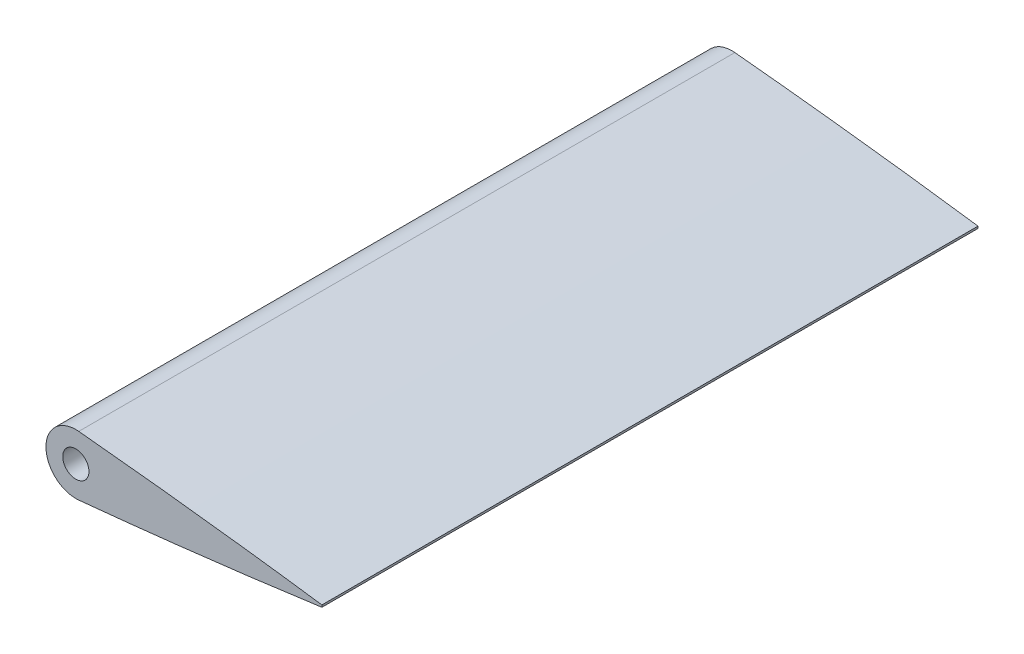
ISO-10303-21;
HEADER;
FILE_DESCRIPTION(('STEP AP214'),'2;1');
FILE_NAME('part.step','',(''),(''),'','','');
FILE_SCHEMA(('AUTOMOTIVE_DESIGN { 1 0 10303 214 1 1 1 1 }'));
ENDSEC;
DATA;
#1=APPLICATION_CONTEXT('core data for automotive mechanical design processes');
#2=APPLICATION_PROTOCOL_DEFINITION('international standard','automotive_design',2000,#1);
#3=PRODUCT_CONTEXT('',#1,'mechanical');
#4=PRODUCT('Part','Part','',(#3));
#5=PRODUCT_RELATED_PRODUCT_CATEGORY('part','',(#4));
#6=PRODUCT_DEFINITION_FORMATION('','',#4);
#7=PRODUCT_DEFINITION_CONTEXT('part definition',#1,'design');
#8=PRODUCT_DEFINITION('design','',#6,#7);
#9=PRODUCT_DEFINITION_SHAPE('','',#8);
#10=(LENGTH_UNIT() NAMED_UNIT(*) SI_UNIT(.MILLI.,.METRE.));
#11=(NAMED_UNIT(*) PLANE_ANGLE_UNIT() SI_UNIT($,.RADIAN.));
#12=(NAMED_UNIT(*) SI_UNIT($,.STERADIAN.) SOLID_ANGLE_UNIT());
#13=UNCERTAINTY_MEASURE_WITH_UNIT(LENGTH_MEASURE(1.E-05),#10,'distance_accuracy_value','');
#14=(GEOMETRIC_REPRESENTATION_CONTEXT(3) GLOBAL_UNCERTAINTY_ASSIGNED_CONTEXT((#13)) GLOBAL_UNIT_ASSIGNED_CONTEXT((#10,
#11,#12)) REPRESENTATION_CONTEXT('',''));
#15=CARTESIAN_POINT('',(0.,0.,0.));
#16=DIRECTION('',(0.,0.,1.));
#17=DIRECTION('',(1.,0.,0.));
#18=AXIS2_PLACEMENT_3D('',#15,#16,#17);
#19=CARTESIAN_POINT('',(175.,0.,0.));
#20=DIRECTION('',(1.,0.,0.));
#21=DIRECTION('',(0.,0.,-1.));
#22=AXIS2_PLACEMENT_3D('',#19,#20,#21);
#23=PLANE('',#22);
#24=DIRECTION('',(0.,-1.,0.));
#25=VECTOR('',#24,1.);
#26=CARTESIAN_POINT('',(175.,0.,140.));
#27=LINE('',#26,#25);
#28=CARTESIAN_POINT('',(175.,0.1575,140.));
#29=VERTEX_POINT('',#28);
#30=CARTESIAN_POINT('',(175.,-0.1575,140.));
#31=VERTEX_POINT('',#30);
#32=EDGE_CURVE('E244',#29,#31,#27,.T.);
#33=ORIENTED_EDGE('',*,*,#32,.F.);
#34=DIRECTION('',(0.,0.,-1.));
#35=VECTOR('',#34,1.);
#36=CARTESIAN_POINT('',(175.,0.1575,240.));
#37=LINE('',#36,#35);
#38=CARTESIAN_POINT('',(175.,0.1575,240.));
#39=VERTEX_POINT('',#38);
#40=EDGE_CURVE('E134',#39,#29,#37,.T.);
#41=ORIENTED_EDGE('',*,*,#40,.F.);
#42=CARTESIAN_POINT('',(175.,-0.1575,240.));
#43=DIRECTION('',(0.,1.,0.));
#44=VECTOR('',#43,1.);
#45=LINE('',#42,#44);
#46=CARTESIAN_POINT('',(175.,-0.1575,240.));
#47=VERTEX_POINT('',#46);
#48=EDGE_CURVE('E158',#47,#39,#45,.T.);
#49=ORIENTED_EDGE('',*,*,#48,.F.);
#50=DIRECTION('',(0.,0.,-1.));
#51=VECTOR('',#50,1.);
#52=CARTESIAN_POINT('',(175.,-0.1575,240.));
#53=LINE('',#52,#51);
#54=EDGE_CURVE('E86',#47,#31,#53,.T.);
#55=ORIENTED_EDGE('',*,*,#54,.T.);
#56=EDGE_LOOP('',(#33,#41,#49,#55));
#57=FACE_BOUND('',#56,.T.);
#58=ADVANCED_FACE('F74',(#57),#23,.T.);
#59=CARTESIAN_POINT('',(175.,0.1575,240.));
#60=CARTESIAN_POINT('',(174.975670099291,0.160914041541677,240.));
#61=CARTESIAN_POINT('',(174.878414868244,0.174561174873842,240.));
#62=CARTESIAN_POINT('',(174.659801499766,0.205159821362737,240.));
#63=CARTESIAN_POINT('',(173.814393736801,0.323268736827635,240.));
#64=CARTESIAN_POINT('',(171.971983222291,0.57756760983331,240.));
#65=CARTESIAN_POINT('',(169.804130316729,0.869468667880044,240.));
#66=CARTESIAN_POINT('',(167.798075845039,1.13373410035728,240.));
#67=CARTESIAN_POINT('',(166.331348146716,1.32444060697064,240.));
#68=CARTESIAN_POINT('',(161.322200966069,1.96622627689324,240.));
#69=CARTESIAN_POINT('',(156.013641601383,2.60401694235936,240.));
#70=CARTESIAN_POINT('',(149.576754994477,3.32818055621066,240.));
#71=CARTESIAN_POINT('',(145.376354095397,3.78430734567515,240.));
#72=CARTESIAN_POINT('',(140.114857130425,4.32702320742082,240.));
#73=CARTESIAN_POINT('',(134.595540648365,4.86377712086384,240.));
#74=CARTESIAN_POINT('',(129.857229802635,5.2939236206402,240.));
#75=CARTESIAN_POINT('',(124.980872811101,5.71026282365352,240.));
#76=CARTESIAN_POINT('',(120.0120690147,6.10561671430527,240.));
#77=CARTESIAN_POINT('',(115.012351702912,6.45951784353202,240.));
#78=CARTESIAN_POINT('',(109.989973527845,6.77673440530095,240.));
#79=CARTESIAN_POINT('',(105.979072501825,6.99718633343155,240.));
#80=CARTESIAN_POINT('',(101.986308858488,7.17846278877443,240.));
#81=CARTESIAN_POINT('',(99.0243670944716,7.29258098720803,240.));
#82=CARTESIAN_POINT('',(96.0938852893426,7.38375281774364,240.));
#83=CARTESIAN_POINT('',(93.2017061002433,7.45066565420669,240.));
#84=CARTESIAN_POINT('',(90.354579605028,7.49204060737605,240.));
#85=CARTESIAN_POINT('',(87.5591504088352,7.50675011459953,240.));
#86=CARTESIAN_POINT('',(84.8219466228125,7.49383510245646,240.));
#87=CARTESIAN_POINT('',(82.1493584308855,7.45253307987314,240.));
#88=CARTESIAN_POINT('',(79.5476260757768,7.38217851087511,240.));
#89=CARTESIAN_POINT('',(77.0228185580325,7.28242210028553,240.));
#90=CARTESIAN_POINT('',(74.5808316410772,7.15305057873661,240.));
#91=CARTESIAN_POINT('',(72.2273654371531,6.99404893787144,240.));
#92=CARTESIAN_POINT('',(69.9679051740815,6.80567273838647,240.));
#93=CARTESIAN_POINT('',(67.8077146053811,6.58837012507359,240.));
#94=CARTESIAN_POINT('',(65.7518313717883,6.34273624779991,240.));
#95=CARTESIAN_POINT('',(63.8050294111967,6.06966614435724,240.));
#96=CARTESIAN_POINT('',(61.9718426706377,5.77004523514184,240.));
#97=CARTESIAN_POINT('',(60.2564977921031,5.4451407514127,240.));
#98=CARTESIAN_POINT('',(58.6629613315306,5.09611834089171,240.));
#99=CARTESIAN_POINT('',(57.194862030039,4.72441172867768,240.));
#100=CARTESIAN_POINT('',(55.855529665828,4.33136969665917,240.));
#101=CARTESIAN_POINT('',(54.6479112309722,3.91848367818142,240.));
#102=CARTESIAN_POINT('',(53.5745877484243,3.48711742013033,240.));
#103=CARTESIAN_POINT('',(52.6376847429848,3.03857139047309,240.));
#104=CARTESIAN_POINT('',(51.8388647422435,2.57385454034864,240.));
#105=CARTESIAN_POINT('',(51.1792966032154,2.09350034520415,240.));
#106=CARTESIAN_POINT('',(50.6599476566587,1.59704066352714,240.));
#107=CARTESIAN_POINT('',(50.2824845062573,1.08274418879119,240.));
#108=CARTESIAN_POINT('',(50.0515051907536,0.548369702368575,240.));
#109=CARTESIAN_POINT('',(49.9748926745013,0.,240.));
#110=CARTESIAN_POINT('',(50.0515051907536,-0.548369702368577,240.));
#111=CARTESIAN_POINT('',(50.2824845062573,-1.08274418879117,240.));
#112=CARTESIAN_POINT('',(50.6599476566587,-1.59704066352716,240.));
#113=CARTESIAN_POINT('',(51.1792966032155,-2.09350034520413,240.));
#114=CARTESIAN_POINT('',(51.8388647422435,-2.57385454034865,240.));
#115=CARTESIAN_POINT('',(52.6376847429847,-3.03857139047308,240.));
#116=CARTESIAN_POINT('',(53.5745877484242,-3.48711742013034,240.));
#117=CARTESIAN_POINT('',(54.6479112309723,-3.91848367818143,240.));
#118=CARTESIAN_POINT('',(55.855529665828,-4.33136969665917,240.));
#119=CARTESIAN_POINT('',(57.194862030039,-4.72441172867768,240.));
#120=CARTESIAN_POINT('',(58.6629613315307,-5.09611834089171,240.));
#121=CARTESIAN_POINT('',(60.256497792103,-5.4451407514127,240.));
#122=CARTESIAN_POINT('',(61.9718426706377,-5.77004523514184,240.));
#123=CARTESIAN_POINT('',(63.8050294111967,-6.06966614435724,240.));
#124=CARTESIAN_POINT('',(65.7518313717883,-6.3427362477999,240.));
#125=CARTESIAN_POINT('',(67.8077146053812,-6.58837012507359,240.));
#126=CARTESIAN_POINT('',(69.9679051740815,-6.80567273838647,240.));
#127=CARTESIAN_POINT('',(72.2273654371531,-6.99404893787144,240.));
#128=CARTESIAN_POINT('',(74.5808316410772,-7.15305057873661,240.));
#129=CARTESIAN_POINT('',(77.0228185580326,-7.28242210028553,240.));
#130=CARTESIAN_POINT('',(79.5476260757768,-7.38217851087511,240.));
#131=CARTESIAN_POINT('',(82.1493584308855,-7.45253307987314,240.));
#132=CARTESIAN_POINT('',(84.8219466228125,-7.49383510245646,240.));
#133=CARTESIAN_POINT('',(87.5591504088352,-7.50675011459953,240.));
#134=CARTESIAN_POINT('',(90.3545796050281,-7.49204060737606,240.));
#135=CARTESIAN_POINT('',(93.2017061002433,-7.45066565420669,240.));
#136=CARTESIAN_POINT('',(96.0938852893426,-7.38375281774365,240.));
#137=CARTESIAN_POINT('',(99.0243670944716,-7.29258098720802,240.));
#138=CARTESIAN_POINT('',(101.986308858488,-7.17846278877443,240.));
#139=CARTESIAN_POINT('',(105.979072501825,-6.99718633343154,240.));
#140=CARTESIAN_POINT('',(109.989973527845,-6.77673440530096,240.));
#141=CARTESIAN_POINT('',(115.012351702912,-6.45951784353202,240.));
#142=CARTESIAN_POINT('',(120.012069394969,-6.1056154437259,240.));
#143=CARTESIAN_POINT('',(125.94642538828,-5.63343673309692,240.));
#144=CARTESIAN_POINT('',(130.822015497018,-5.20794437163472,240.));
#145=CARTESIAN_POINT('',(135.559592926317,-4.77002296948723,240.));
#146=CARTESIAN_POINT('',(140.957893319994,-4.24503729669465,240.));
#147=CARTESIAN_POINT('',(147.758819189274,-3.53419059637897,240.));
#148=CARTESIAN_POINT('',(155.953465965731,-2.61330750081689,240.));
#149=CARTESIAN_POINT('',(162.074632205995,-1.86982272355947,240.));
#150=CARTESIAN_POINT('',(166.331348146716,-1.32444060697065,240.));
#151=CARTESIAN_POINT('',(168.557587042106,-1.03498112303783,240.));
#152=CARTESIAN_POINT('',(170.827923989427,-0.732698223571853,240.));
#153=CARTESIAN_POINT('',(172.995190212219,-0.436495753077521,240.));
#154=CARTESIAN_POINT('',(174.078806920385,-0.286328510210598,240.));
#155=CARTESIAN_POINT('',(174.659801499766,-0.205159821362731,240.));
#156=CARTESIAN_POINT('',(174.878414868244,-0.174561174873843,240.));
#157=CARTESIAN_POINT('',(174.975670099291,-0.160914041541677,240.));
#158=CARTESIAN_POINT('',(175.,-0.1575,240.));
#159=B_SPLINE_CURVE_WITH_KNOTS('',3,(#59,#60,#61,#62,#63,#64,#65,#66,#67,#68,#69,#70,#71,#72,
#73,#74,#75,#76,#77,#78,#79,#80,#81,#82,#83,#84,#85,#86,#87,#88,#89,#90,#91,#92,#93,#94,#95,#96,
#97,#98,#99,#100,#101,#102,#103,#104,#105,#106,#107,#108,#109,#110,#111,#112,#113,#114,#115,
#116,#117,#118,#119,#120,#121,#122,#123,#124,#125,#126,#127,#128,#129,#130,#131,#132,#133,#134,
#135,#136,#137,#138,#139,#140,#141,#142,#143,#144,#145,#146,#147,#148,#149,#150,#151,#152,#153,
#154,#155,#156,#157,#158),.UNSPECIFIED.,.F.,.F.,(4,1,1,1,1,1,1,1,1,1,1,1,1,1,1,1,1,1,1,1,1,1,1,
1,1,1,1,1,1,1,1,1,1,1,1,1,1,1,1,1,1,1,1,1,1,1,1,1,1,1,1,1,1,1,1,1,1,1,1,1,1,1,1,1,1,1,1,1,1,1,1,
1,1,1,1,1,1,1,1,1,1,1,1,1,1,1,1,1,1,1,1,1,1,1,1,1,1,4),(0.,0.000289157089474186,
0.0011558633091664,0.00259805876717436,0.0103358462744863,0.0230457377742648,0.0283428836686461,
0.0341501483557849,0.0404537393346738,0.0877801023888762,0.0970773519152032,0.116690750020973,
0.137507311613728,0.159331021819007,0.181956667595326,0.193504001733211,0.21693215026303,
0.24062147148056,0.252494877562422,0.276160723248583,0.287898269502264,0.299535917539716,
0.311046970510736,0.322405027863275,0.333584243393343,0.344559419732818,0.355305879102253,
0.365799644675589,0.376017645463572,0.385937517863606,0.395537813641388,0.404798066410151,
0.41369880992526,0.422221683237475,0.430349464839536,0.438066152610253,0.445357160907796,
0.452209437176443,0.458611487663545,0.464554011593151,0.470029939859423,0.475035092647181,
0.479569168875679,0.483636928018542,0.487250234247951,0.490431505137214,0.493218859081049,
0.495674082647599,0.497891237495517,0.5,0.502108762504483,0.504325917352401,0.50678114091895,
0.509568494862786,0.512749765752048,0.516363071981458,0.520430831124321,0.524964907352819,
0.529970060140576,0.535445988406849,0.541388512336455,0.547790562823557,0.554642839092204,
0.561933847389747,0.569650535160464,0.577778316762525,0.58630119007474,0.595201933589849,
0.604462186358612,0.614062482136394,0.623982354536427,0.634200355324411,0.644694120897747,
0.655440580267181,0.666415756606657,0.677594972136725,0.688953029489264,0.700464082460284,
0.712101730497736,0.723839276751416,0.747505122437578,0.75937852851944,0.78306784973697,
0.806495998266789,0.829443250621851,0.840668978180993,0.862492688386272,0.893278152539754,
0.921148048165806,0.959546260665326,0.965849851644215,0.971657116331354,0.985968595369371,
0.99280639725374,0.997401941232826,0.998844136690833,0.999710842910526,1.),.UNSPECIFIED.);
#160=DIRECTION('',(0.,0.,-1.));
#161=VECTOR('',#160,1.);
#162=SURFACE_OF_LINEAR_EXTRUSION('',#159,#161);
#163=CARTESIAN_POINT('',(175.,0.1575,140.));
#164=CARTESIAN_POINT('',(174.975670099291,0.160914041541677,140.));
#165=CARTESIAN_POINT('',(174.878414868244,0.174561174873842,140.));
#166=CARTESIAN_POINT('',(174.659801499766,0.205159821362737,140.));
#167=CARTESIAN_POINT('',(173.814393736801,0.323268736827635,140.));
#168=CARTESIAN_POINT('',(171.971983222291,0.57756760983331,140.));
#169=CARTESIAN_POINT('',(169.804130316729,0.869468667880044,140.));
#170=CARTESIAN_POINT('',(167.798075845039,1.13373410035728,140.));
#171=CARTESIAN_POINT('',(166.331348146716,1.32444060697064,140.));
#172=CARTESIAN_POINT('',(161.322200966069,1.96622627689324,140.));
#173=CARTESIAN_POINT('',(156.013641601383,2.60401694235936,140.));
#174=CARTESIAN_POINT('',(149.576754994477,3.32818055621066,140.));
#175=CARTESIAN_POINT('',(145.376354095397,3.78430734567515,140.));
#176=CARTESIAN_POINT('',(140.114857130425,4.32702320742082,140.));
#177=CARTESIAN_POINT('',(134.595540648365,4.86377712086384,140.));
#178=CARTESIAN_POINT('',(129.857229802635,5.2939236206402,140.));
#179=CARTESIAN_POINT('',(124.980872811101,5.71026282365352,140.));
#180=CARTESIAN_POINT('',(120.0120690147,6.10561671430527,140.));
#181=CARTESIAN_POINT('',(115.012351702912,6.45951784353202,140.));
#182=CARTESIAN_POINT('',(109.989973527845,6.77673440530095,140.));
#183=CARTESIAN_POINT('',(105.979072501825,6.99718633343155,140.));
#184=CARTESIAN_POINT('',(101.986308858488,7.17846278877443,140.));
#185=CARTESIAN_POINT('',(99.0243670944716,7.29258098720803,140.));
#186=CARTESIAN_POINT('',(96.0938852893426,7.38375281774364,140.));
#187=CARTESIAN_POINT('',(93.2017061002433,7.45066565420669,140.));
#188=CARTESIAN_POINT('',(90.354579605028,7.49204060737605,140.));
#189=CARTESIAN_POINT('',(87.5591504088352,7.50675011459953,140.));
#190=CARTESIAN_POINT('',(84.8219466228125,7.49383510245646,140.));
#191=CARTESIAN_POINT('',(82.1493584308855,7.45253307987314,140.));
#192=CARTESIAN_POINT('',(79.5476260757768,7.38217851087511,140.));
#193=CARTESIAN_POINT('',(77.0228185580325,7.28242210028553,140.));
#194=CARTESIAN_POINT('',(74.5808316410772,7.15305057873661,140.));
#195=CARTESIAN_POINT('',(72.2273654371531,6.99404893787144,140.));
#196=CARTESIAN_POINT('',(69.9679051740815,6.80567273838647,140.));
#197=CARTESIAN_POINT('',(67.8077146053811,6.58837012507359,140.));
#198=CARTESIAN_POINT('',(65.7518313717883,6.34273624779991,140.));
#199=CARTESIAN_POINT('',(63.8050294111967,6.06966614435724,140.));
#200=CARTESIAN_POINT('',(61.9718426706377,5.77004523514184,140.));
#201=CARTESIAN_POINT('',(60.2564977921031,5.4451407514127,140.));
#202=CARTESIAN_POINT('',(58.6629613315306,5.09611834089171,140.));
#203=CARTESIAN_POINT('',(57.194862030039,4.72441172867768,140.));
#204=CARTESIAN_POINT('',(55.855529665828,4.33136969665917,140.));
#205=CARTESIAN_POINT('',(54.6479112309722,3.91848367818142,140.));
#206=CARTESIAN_POINT('',(53.5745877484243,3.48711742013033,140.));
#207=CARTESIAN_POINT('',(52.6376847429848,3.03857139047309,140.));
#208=CARTESIAN_POINT('',(51.8388647422435,2.57385454034864,140.));
#209=CARTESIAN_POINT('',(51.1792966032154,2.09350034520415,140.));
#210=CARTESIAN_POINT('',(50.6599476566587,1.59704066352714,140.));
#211=CARTESIAN_POINT('',(50.2824845062573,1.08274418879119,140.));
#212=CARTESIAN_POINT('',(50.0515051907536,0.548369702368575,140.));
#213=CARTESIAN_POINT('',(49.9748926745013,0.,140.));
#214=CARTESIAN_POINT('',(50.0515051907536,-0.548369702368577,140.));
#215=CARTESIAN_POINT('',(50.2824845062573,-1.08274418879117,140.));
#216=CARTESIAN_POINT('',(50.6599476566587,-1.59704066352716,140.));
#217=CARTESIAN_POINT('',(51.1792966032155,-2.09350034520413,140.));
#218=CARTESIAN_POINT('',(51.8388647422435,-2.57385454034865,140.));
#219=CARTESIAN_POINT('',(52.6376847429847,-3.03857139047308,140.));
#220=CARTESIAN_POINT('',(53.5745877484242,-3.48711742013034,140.));
#221=CARTESIAN_POINT('',(54.6479112309723,-3.91848367818143,140.));
#222=CARTESIAN_POINT('',(55.855529665828,-4.33136969665917,140.));
#223=CARTESIAN_POINT('',(57.194862030039,-4.72441172867768,140.));
#224=CARTESIAN_POINT('',(58.6629613315307,-5.09611834089171,140.));
#225=CARTESIAN_POINT('',(60.256497792103,-5.4451407514127,140.));
#226=CARTESIAN_POINT('',(61.9718426706377,-5.77004523514184,140.));
#227=CARTESIAN_POINT('',(63.8050294111967,-6.06966614435724,140.));
#228=CARTESIAN_POINT('',(65.7518313717883,-6.3427362477999,140.));
#229=CARTESIAN_POINT('',(67.8077146053812,-6.58837012507359,140.));
#230=CARTESIAN_POINT('',(69.9679051740815,-6.80567273838647,140.));
#231=CARTESIAN_POINT('',(72.2273654371531,-6.99404893787144,140.));
#232=CARTESIAN_POINT('',(74.5808316410772,-7.15305057873661,140.));
#233=CARTESIAN_POINT('',(77.0228185580326,-7.28242210028553,140.));
#234=CARTESIAN_POINT('',(79.5476260757768,-7.38217851087511,140.));
#235=CARTESIAN_POINT('',(82.1493584308855,-7.45253307987314,140.));
#236=CARTESIAN_POINT('',(84.8219466228125,-7.49383510245646,140.));
#237=CARTESIAN_POINT('',(87.5591504088352,-7.50675011459953,140.));
#238=CARTESIAN_POINT('',(90.3545796050281,-7.49204060737606,140.));
#239=CARTESIAN_POINT('',(93.2017061002433,-7.45066565420669,140.));
#240=CARTESIAN_POINT('',(96.0938852893426,-7.38375281774365,140.));
#241=CARTESIAN_POINT('',(99.0243670944716,-7.29258098720802,140.));
#242=CARTESIAN_POINT('',(101.986308858488,-7.17846278877443,140.));
#243=CARTESIAN_POINT('',(105.979072501825,-6.99718633343154,140.));
#244=CARTESIAN_POINT('',(109.989973527845,-6.77673440530096,140.));
#245=CARTESIAN_POINT('',(115.012351702912,-6.45951784353202,140.));
#246=CARTESIAN_POINT('',(120.012069394969,-6.1056154437259,140.));
#247=CARTESIAN_POINT('',(125.94642538828,-5.63343673309692,140.));
#248=CARTESIAN_POINT('',(130.822015497018,-5.20794437163472,140.));
#249=CARTESIAN_POINT('',(135.559592926317,-4.77002296948723,140.));
#250=CARTESIAN_POINT('',(140.957893319994,-4.24503729669465,140.));
#251=CARTESIAN_POINT('',(147.758819189274,-3.53419059637897,140.));
#252=CARTESIAN_POINT('',(155.953465965731,-2.61330750081689,140.));
#253=CARTESIAN_POINT('',(162.074632205995,-1.86982272355947,140.));
#254=CARTESIAN_POINT('',(166.331348146716,-1.32444060697065,140.));
#255=CARTESIAN_POINT('',(168.557587042106,-1.03498112303783,140.));
#256=CARTESIAN_POINT('',(170.827923989427,-0.732698223571853,140.));
#257=CARTESIAN_POINT('',(172.995190212219,-0.436495753077521,140.));
#258=CARTESIAN_POINT('',(174.078806920385,-0.286328510210598,140.));
#259=CARTESIAN_POINT('',(174.659801499766,-0.205159821362731,140.));
#260=CARTESIAN_POINT('',(174.878414868244,-0.174561174873843,140.));
#261=CARTESIAN_POINT('',(174.975670099291,-0.160914041541677,140.));
#262=CARTESIAN_POINT('',(175.,-0.1575,140.));
#263=B_SPLINE_CURVE_WITH_KNOTS('',3,(#163,#164,#165,#166,#167,#168,#169,#170,#171,#172,#173,
#174,#175,#176,#177,#178,#179,#180,#181,#182,#183,#184,#185,#186,#187,#188,#189,#190,#191,#192,
#193,#194,#195,#196,#197,#198,#199,#200,#201,#202,#203,#204,#205,#206,#207,#208,#209,#210,#211,
#212,#213,#214,#215,#216,#217,#218,#219,#220,#221,#222,#223,#224,#225,#226,#227,#228,#229,#230,
#231,#232,#233,#234,#235,#236,#237,#238,#239,#240,#241,#242,#243,#244,#245,#246,#247,#248,#249,
#250,#251,#252,#253,#254,#255,#256,#257,#258,#259,#260,#261,#262),.UNSPECIFIED.,.F.,.F.,(4,1,1,
1,1,1,1,1,1,1,1,1,1,1,1,1,1,1,1,1,1,1,1,1,1,1,1,1,1,1,1,1,1,1,1,1,1,1,1,1,1,1,1,1,1,1,1,1,1,1,1,
1,1,1,1,1,1,1,1,1,1,1,1,1,1,1,1,1,1,1,1,1,1,1,1,1,1,1,1,1,1,1,1,1,1,1,1,1,1,1,1,1,1,1,1,1,1,4),
(0.,0.000289157089474186,0.0011558633091664,0.00259805876717436,0.0103358462744863,
0.0230457377742648,0.0283428836686461,0.0341501483557849,0.0404537393346738,0.0877801023888762,
0.0970773519152032,0.116690750020973,0.137507311613728,0.159331021819007,0.181956667595326,
0.193504001733211,0.21693215026303,0.24062147148056,0.252494877562422,0.276160723248583,
0.287898269502264,0.299535917539716,0.311046970510736,0.322405027863275,0.333584243393343,
0.344559419732818,0.355305879102253,0.365799644675589,0.376017645463572,0.385937517863606,
0.395537813641388,0.404798066410151,0.41369880992526,0.422221683237475,0.430349464839536,
0.438066152610253,0.445357160907796,0.452209437176443,0.458611487663545,0.464554011593151,
0.470029939859423,0.475035092647181,0.479569168875679,0.483636928018542,0.487250234247951,
0.490431505137214,0.493218859081049,0.495674082647599,0.497891237495517,0.5,0.502108762504483,
0.504325917352401,0.50678114091895,0.509568494862786,0.512749765752048,0.516363071981458,
0.520430831124321,0.524964907352819,0.529970060140576,0.535445988406849,0.541388512336455,
0.547790562823557,0.554642839092204,0.561933847389747,0.569650535160464,0.577778316762525,
0.58630119007474,0.595201933589849,0.604462186358612,0.614062482136394,0.623982354536427,
0.634200355324411,0.644694120897747,0.655440580267181,0.666415756606657,0.677594972136725,
0.688953029489264,0.700464082460284,0.712101730497736,0.723839276751416,0.747505122437578,
0.75937852851944,0.78306784973697,0.806495998266789,0.829443250621851,0.840668978180993,
0.862492688386272,0.893278152539754,0.921148048165806,0.959546260665326,0.965849851644215,
0.971657116331354,0.985968595369371,0.99280639725374,0.997401941232826,0.998844136690833,
0.999710842910526,1.),.UNSPECIFIED.);
#264=CARTESIAN_POINT('',(137.943583597245,-4.53662744899246,140.));
#265=VERTEX_POINT('',#264);
#266=EDGE_CURVE('E78',#265,#31,#263,.T.);
#267=ORIENTED_EDGE('',*,*,#266,.T.);
#268=ORIENTED_EDGE('',*,*,#54,.F.);
#269=CARTESIAN_POINT('',(175.,-0.1575,240.));
#270=CARTESIAN_POINT('',(174.975670099291,-0.160914041541677,240.));
#271=CARTESIAN_POINT('',(174.878414868244,-0.174561174873843,240.));
#272=CARTESIAN_POINT('',(174.659801499766,-0.205159821362731,240.));
#273=CARTESIAN_POINT('',(174.078806920385,-0.286328510210598,240.));
#274=CARTESIAN_POINT('',(172.995190212219,-0.436495753077521,240.));
#275=CARTESIAN_POINT('',(170.827923989427,-0.732698223571853,240.));
#276=CARTESIAN_POINT('',(168.557587042106,-1.03498112303783,240.));
#277=CARTESIAN_POINT('',(166.331348146716,-1.32444060697065,240.));
#278=CARTESIAN_POINT('',(162.074632205995,-1.86982272355947,240.));
#279=CARTESIAN_POINT('',(155.953465965731,-2.61330750081689,240.));
#280=CARTESIAN_POINT('',(147.758819189274,-3.53419059637897,240.));
#281=CARTESIAN_POINT('',(142.050565741615,-4.13082893736768,240.));
#282=CARTESIAN_POINT('',(138.695644646101,-4.46308848456144,240.));
#283=CARTESIAN_POINT('',(137.94359190283,-4.53662433040611,240.));
#284=B_SPLINE_CURVE_WITH_KNOTS('',3,(#269,#270,#271,#272,#273,#274,#275,#276,#277,#278,#279,
#280,#281,#282,#283),.UNSPECIFIED.,.F.,.F.,(4,1,1,1,1,1,1,1,1,1,1,1,4),(0.853599167684642,
0.853888324774116,0.854755030993808,0.856197226451816,0.860792770430902,0.867630572315271,
0.881942051353288,0.887749316040427,0.894052907019316,0.932451119518836,0.960321015144888,
0.99110647929837,1.),.UNSPECIFIED.);
#285=CARTESIAN_POINT('',(137.943591877889,-4.5366240753357,240.));
#286=VERTEX_POINT('',#285);
#287=EDGE_CURVE('E124',#286,#47,#284,.F.);
#288=ORIENTED_EDGE('',*,*,#287,.F.);
#289=DIRECTION('',(0.,0.,-1.));
#290=VECTOR('',#289,1.);
#291=CARTESIAN_POINT('',(137.943591877889,-4.5366240753357,240.));
#292=LINE('',#291,#290);
#293=EDGE_CURVE('E139',#286,#265,#292,.T.);
#294=ORIENTED_EDGE('',*,*,#293,.T.);
#295=EDGE_LOOP('',(#267,#268,#288,#294));
#296=FACE_BOUND('',#295,.T.);
#297=ADVANCED_FACE('F173',(#296),#162,.F.);
#298=CARTESIAN_POINT('',(175.,0.1575,240.));
#299=CARTESIAN_POINT('',(174.975670099291,0.160914041541677,240.));
#300=CARTESIAN_POINT('',(174.878414868244,0.174561174873842,240.));
#301=CARTESIAN_POINT('',(174.659801499766,0.205159821362737,240.));
#302=CARTESIAN_POINT('',(173.814393736801,0.323268736827635,240.));
#303=CARTESIAN_POINT('',(171.971983222291,0.57756760983331,240.));
#304=CARTESIAN_POINT('',(169.804130316729,0.869468667880044,240.));
#305=CARTESIAN_POINT('',(167.798075845039,1.13373410035728,240.));
#306=CARTESIAN_POINT('',(166.331348146716,1.32444060697064,240.));
#307=CARTESIAN_POINT('',(161.322200966069,1.96622627689324,240.));
#308=CARTESIAN_POINT('',(156.013641601383,2.60401694235936,240.));
#309=CARTESIAN_POINT('',(149.576754994477,3.32818055621066,240.));
#310=CARTESIAN_POINT('',(145.376354095397,3.78430734567515,240.));
#311=CARTESIAN_POINT('',(140.114857130425,4.32702320742082,240.));
#312=CARTESIAN_POINT('',(134.595540648365,4.86377712086384,240.));
#313=CARTESIAN_POINT('',(129.857229802635,5.2939236206402,240.));
#314=CARTESIAN_POINT('',(124.980872811101,5.71026282365352,240.));
#315=CARTESIAN_POINT('',(120.0120690147,6.10561671430527,240.));
#316=CARTESIAN_POINT('',(115.012351702912,6.45951784353202,240.));
#317=CARTESIAN_POINT('',(109.989973527845,6.77673440530095,240.));
#318=CARTESIAN_POINT('',(105.979072501825,6.99718633343155,240.));
#319=CARTESIAN_POINT('',(101.986308858488,7.17846278877443,240.));
#320=CARTESIAN_POINT('',(99.0243670944716,7.29258098720803,240.));
#321=CARTESIAN_POINT('',(96.0938852893426,7.38375281774364,240.));
#322=CARTESIAN_POINT('',(93.2017061002433,7.45066565420669,240.));
#323=CARTESIAN_POINT('',(90.354579605028,7.49204060737605,240.));
#324=CARTESIAN_POINT('',(87.5591504088352,7.50675011459953,240.));
#325=CARTESIAN_POINT('',(84.8219466228125,7.49383510245646,240.));
#326=CARTESIAN_POINT('',(82.1493584308855,7.45253307987314,240.));
#327=CARTESIAN_POINT('',(79.5476260757768,7.38217851087511,240.));
#328=CARTESIAN_POINT('',(77.0228185580325,7.28242210028553,240.));
#329=CARTESIAN_POINT('',(74.5808316410772,7.15305057873661,240.));
#330=CARTESIAN_POINT('',(72.2273654371531,6.99404893787144,240.));
#331=CARTESIAN_POINT('',(69.9679051740815,6.80567273838647,240.));
#332=CARTESIAN_POINT('',(67.8077146053811,6.58837012507359,240.));
#333=CARTESIAN_POINT('',(65.7518313717883,6.34273624779991,240.));
#334=CARTESIAN_POINT('',(63.8050294111967,6.06966614435724,240.));
#335=CARTESIAN_POINT('',(61.9718426706377,5.77004523514184,240.));
#336=CARTESIAN_POINT('',(60.2564977921031,5.4451407514127,240.));
#337=CARTESIAN_POINT('',(58.6629613315306,5.09611834089171,240.));
#338=CARTESIAN_POINT('',(57.194862030039,4.72441172867768,240.));
#339=CARTESIAN_POINT('',(55.855529665828,4.33136969665917,240.));
#340=CARTESIAN_POINT('',(54.6479112309722,3.91848367818142,240.));
#341=CARTESIAN_POINT('',(53.5745877484243,3.48711742013033,240.));
#342=CARTESIAN_POINT('',(52.6376847429848,3.03857139047309,240.));
#343=CARTESIAN_POINT('',(51.8388647422435,2.57385454034864,240.));
#344=CARTESIAN_POINT('',(51.1792966032154,2.09350034520415,240.));
#345=CARTESIAN_POINT('',(50.6599476566587,1.59704066352714,240.));
#346=CARTESIAN_POINT('',(50.2824845062573,1.08274418879119,240.));
#347=CARTESIAN_POINT('',(50.0515051907536,0.548369702368575,240.));
#348=CARTESIAN_POINT('',(49.9748926745013,0.,240.));
#349=CARTESIAN_POINT('',(50.0515051907536,-0.548369702368577,240.));
#350=CARTESIAN_POINT('',(50.2824845062573,-1.08274418879117,240.));
#351=CARTESIAN_POINT('',(50.6599476566587,-1.59704066352716,240.));
#352=CARTESIAN_POINT('',(51.1792966032155,-2.09350034520413,240.));
#353=CARTESIAN_POINT('',(51.8388647422435,-2.57385454034865,240.));
#354=CARTESIAN_POINT('',(52.6376847429847,-3.03857139047308,240.));
#355=CARTESIAN_POINT('',(53.5745877484242,-3.48711742013034,240.));
#356=CARTESIAN_POINT('',(54.6479112309723,-3.91848367818143,240.));
#357=CARTESIAN_POINT('',(55.855529665828,-4.33136969665917,240.));
#358=CARTESIAN_POINT('',(57.194862030039,-4.72441172867768,240.));
#359=CARTESIAN_POINT('',(58.6629613315307,-5.09611834089171,240.));
#360=CARTESIAN_POINT('',(60.256497792103,-5.4451407514127,240.));
#361=CARTESIAN_POINT('',(61.9718426706377,-5.77004523514184,240.));
#362=CARTESIAN_POINT('',(63.8050294111967,-6.06966614435724,240.));
#363=CARTESIAN_POINT('',(65.7518313717883,-6.3427362477999,240.));
#364=CARTESIAN_POINT('',(67.8077146053812,-6.58837012507359,240.));
#365=CARTESIAN_POINT('',(69.9679051740815,-6.80567273838647,240.));
#366=CARTESIAN_POINT('',(72.2273654371531,-6.99404893787144,240.));
#367=CARTESIAN_POINT('',(74.5808316410772,-7.15305057873661,240.));
#368=CARTESIAN_POINT('',(77.0228185580326,-7.28242210028553,240.));
#369=CARTESIAN_POINT('',(79.5476260757768,-7.38217851087511,240.));
#370=CARTESIAN_POINT('',(82.1493584308855,-7.45253307987314,240.));
#371=CARTESIAN_POINT('',(84.8219466228125,-7.49383510245646,240.));
#372=CARTESIAN_POINT('',(87.5591504088352,-7.50675011459953,240.));
#373=CARTESIAN_POINT('',(90.3545796050281,-7.49204060737606,240.));
#374=CARTESIAN_POINT('',(93.2017061002433,-7.45066565420669,240.));
#375=CARTESIAN_POINT('',(96.0938852893426,-7.38375281774365,240.));
#376=CARTESIAN_POINT('',(99.0243670944716,-7.29258098720802,240.));
#377=CARTESIAN_POINT('',(101.986308858488,-7.17846278877443,240.));
#378=CARTESIAN_POINT('',(105.979072501825,-6.99718633343154,240.));
#379=CARTESIAN_POINT('',(109.989973527845,-6.77673440530096,240.));
#380=CARTESIAN_POINT('',(115.012351702912,-6.45951784353202,240.));
#381=CARTESIAN_POINT('',(120.012069394969,-6.1056154437259,240.));
#382=CARTESIAN_POINT('',(125.94642538828,-5.63343673309692,240.));
#383=CARTESIAN_POINT('',(130.822015497018,-5.20794437163472,240.));
#384=CARTESIAN_POINT('',(135.559592926317,-4.77002296948723,240.));
#385=CARTESIAN_POINT('',(140.957893319994,-4.24503729669465,240.));
#386=CARTESIAN_POINT('',(147.758819189274,-3.53419059637897,240.));
#387=CARTESIAN_POINT('',(155.953465965731,-2.61330750081689,240.));
#388=CARTESIAN_POINT('',(162.074632205995,-1.86982272355947,240.));
#389=CARTESIAN_POINT('',(166.331348146716,-1.32444060697065,240.));
#390=CARTESIAN_POINT('',(168.557587042106,-1.03498112303783,240.));
#391=CARTESIAN_POINT('',(170.827923989427,-0.732698223571853,240.));
#392=CARTESIAN_POINT('',(172.995190212219,-0.436495753077521,240.));
#393=CARTESIAN_POINT('',(174.078806920385,-0.286328510210598,240.));
#394=CARTESIAN_POINT('',(174.659801499766,-0.205159821362731,240.));
#395=CARTESIAN_POINT('',(174.878414868244,-0.174561174873843,240.));
#396=CARTESIAN_POINT('',(174.975670099291,-0.160914041541677,240.));
#397=CARTESIAN_POINT('',(175.,-0.1575,240.));
#398=B_SPLINE_CURVE_WITH_KNOTS('',3,(#298,#299,#300,#301,#302,#303,#304,#305,#306,#307,#308,
#309,#310,#311,#312,#313,#314,#315,#316,#317,#318,#319,#320,#321,#322,#323,#324,#325,#326,#327,
#328,#329,#330,#331,#332,#333,#334,#335,#336,#337,#338,#339,#340,#341,#342,#343,#344,#345,#346,
#347,#348,#349,#350,#351,#352,#353,#354,#355,#356,#357,#358,#359,#360,#361,#362,#363,#364,#365,
#366,#367,#368,#369,#370,#371,#372,#373,#374,#375,#376,#377,#378,#379,#380,#381,#382,#383,#384,
#385,#386,#387,#388,#389,#390,#391,#392,#393,#394,#395,#396,#397),.UNSPECIFIED.,.F.,.F.,(4,1,1,
1,1,1,1,1,1,1,1,1,1,1,1,1,1,1,1,1,1,1,1,1,1,1,1,1,1,1,1,1,1,1,1,1,1,1,1,1,1,1,1,1,1,1,1,1,1,1,1,
1,1,1,1,1,1,1,1,1,1,1,1,1,1,1,1,1,1,1,1,1,1,1,1,1,1,1,1,1,1,1,1,1,1,1,1,1,1,1,1,1,1,1,1,1,1,4),
(0.,0.000289157089474186,0.0011558633091664,0.00259805876717436,0.0103358462744863,
0.0230457377742648,0.0283428836686461,0.0341501483557849,0.0404537393346738,0.0877801023888762,
0.0970773519152032,0.116690750020973,0.137507311613728,0.159331021819007,0.181956667595326,
0.193504001733211,0.21693215026303,0.24062147148056,0.252494877562422,0.276160723248583,
0.287898269502264,0.299535917539716,0.311046970510736,0.322405027863275,0.333584243393343,
0.344559419732818,0.355305879102253,0.365799644675589,0.376017645463572,0.385937517863606,
0.395537813641388,0.404798066410151,0.41369880992526,0.422221683237475,0.430349464839536,
0.438066152610253,0.445357160907796,0.452209437176443,0.458611487663545,0.464554011593151,
0.470029939859423,0.475035092647181,0.479569168875679,0.483636928018542,0.487250234247951,
0.490431505137214,0.493218859081049,0.495674082647599,0.497891237495517,0.5,0.502108762504483,
0.504325917352401,0.50678114091895,0.509568494862786,0.512749765752048,0.516363071981458,
0.520430831124321,0.524964907352819,0.529970060140576,0.535445988406849,0.541388512336455,
0.547790562823557,0.554642839092204,0.561933847389747,0.569650535160464,0.577778316762525,
0.58630119007474,0.595201933589849,0.604462186358612,0.614062482136394,0.623982354536427,
0.634200355324411,0.644694120897747,0.655440580267181,0.666415756606657,0.677594972136725,
0.688953029489264,0.700464082460284,0.712101730497736,0.723839276751416,0.747505122437578,
0.75937852851944,0.78306784973697,0.806495998266789,0.829443250621851,0.840668978180993,
0.862492688386272,0.893278152539754,0.921148048165806,0.959546260665326,0.965849851644215,
0.971657116331354,0.985968595369371,0.99280639725374,0.997401941232826,0.998844136690833,
0.999710842910526,1.),.UNSPECIFIED.);
#399=DIRECTION('',(0.,0.,-1.));
#400=VECTOR('',#399,1.);
#401=SURFACE_OF_LINEAR_EXTRUSION('',#398,#400);
#402=CARTESIAN_POINT('',(137.943587645398,4.53662423167826,140.));
#403=VERTEX_POINT('',#402);
#404=EDGE_CURVE('E12',#29,#403,#263,.T.);
#405=ORIENTED_EDGE('',*,*,#404,.T.);
#406=DIRECTION('',(0.,0.,-1.));
#407=VECTOR('',#406,1.);
#408=CARTESIAN_POINT('',(137.943597424835,4.53662327544175,240.));
#409=LINE('',#408,#407);
#410=CARTESIAN_POINT('',(137.943597424835,4.53662327544175,240.));
#411=VERTEX_POINT('',#410);
#412=EDGE_CURVE('E132',#411,#403,#409,.T.);
#413=ORIENTED_EDGE('',*,*,#412,.F.);
#414=CARTESIAN_POINT('',(137.943597424835,4.53662327544174,240.));
#415=CARTESIAN_POINT('',(138.695648222186,4.46308668736837,240.));
#416=CARTESIAN_POINT('',(141.207680564955,4.21430003833891,240.));
#417=CARTESIAN_POINT('',(145.376354095397,3.78430734567515,240.));
#418=CARTESIAN_POINT('',(149.576754994477,3.32818055621066,240.));
#419=CARTESIAN_POINT('',(156.013641601383,2.60401694235936,240.));
#420=CARTESIAN_POINT('',(161.322200966069,1.96622627689324,240.));
#421=CARTESIAN_POINT('',(166.331348146716,1.32444060697064,240.));
#422=CARTESIAN_POINT('',(167.798075845039,1.13373410035728,240.));
#423=CARTESIAN_POINT('',(169.804130316729,0.869468667880044,240.));
#424=CARTESIAN_POINT('',(171.971983222291,0.57756760983331,240.));
#425=CARTESIAN_POINT('',(173.814393736801,0.323268736827635,240.));
#426=CARTESIAN_POINT('',(174.659801499766,0.205159821362737,240.));
#427=CARTESIAN_POINT('',(174.878414868244,0.174561174873842,240.));
#428=CARTESIAN_POINT('',(174.975670099291,0.160914041541677,240.));
#429=CARTESIAN_POINT('',(175.,0.1575,240.));
#430=B_SPLINE_CURVE_WITH_KNOTS('',3,(#414,#415,#416,#417,#418,#419,#420,#421,#422,#423,#424,
#425,#426,#427,#428,#429),.UNSPECIFIED.,.F.,.F.,(4,1,1,1,1,1,1,1,1,1,1,1,1,4),(0.,
0.00889349855463079,0.0297100601473858,0.0493234582531558,0.0586207077794827,0.105947070833685,
0.112250661812574,0.118057926499713,0.123355072394094,0.136064963893873,0.143802751401185,
0.145244946859193,0.146111653078885,0.146400810168359),.UNSPECIFIED.);
#431=EDGE_CURVE('E152',#39,#411,#430,.F.);
#432=ORIENTED_EDGE('',*,*,#431,.F.);
#433=ORIENTED_EDGE('',*,*,#40,.T.);
#434=EDGE_LOOP('',(#405,#413,#432,#433));
#435=FACE_BOUND('',#434,.T.);
#436=ADVANCED_FACE('F130',(#435),#401,.F.);
#437=CARTESIAN_POINT('',(137.5,0.,240.));
#438=DIRECTION('',(0.,0.,-1.));
#439=DIRECTION('',(-1.,0.,0.));
#440=AXIS2_PLACEMENT_3D('',#437,#438,#439);
#441=CYLINDRICAL_SURFACE('',#440,4.55825947249608);
#442=CARTESIAN_POINT('',(137.5,0.,140.));
#443=DIRECTION('',(0.,0.,1.));
#444=DIRECTION('',(1.,0.,0.));
#445=AXIS2_PLACEMENT_3D('',#442,#443,#444);
#446=CIRCLE('',#445,4.55825947249608);
#447=EDGE_CURVE('E114',#403,#265,#446,.T.);
#448=ORIENTED_EDGE('',*,*,#447,.T.);
#449=ORIENTED_EDGE('',*,*,#293,.F.);
#450=CARTESIAN_POINT('',(137.5,0.,240.));
#451=DIRECTION('',(0.,0.,1.));
#452=DIRECTION('',(1.,0.,0.));
#453=AXIS2_PLACEMENT_3D('',#450,#451,#452);
#454=CIRCLE('',#453,4.55825947249608);
#455=EDGE_CURVE('E93',#411,#286,#454,.T.);
#456=ORIENTED_EDGE('',*,*,#455,.F.);
#457=ORIENTED_EDGE('',*,*,#412,.T.);
#458=EDGE_LOOP('',(#448,#449,#456,#457));
#459=FACE_BOUND('',#458,.T.);
#460=ADVANCED_FACE('F137',(#459),#441,.T.);
#461=CARTESIAN_POINT('',(137.5,0.,240.));
#462=DIRECTION('',(0.,0.,-1.));
#463=DIRECTION('',(-1.,0.,0.));
#464=AXIS2_PLACEMENT_3D('',#461,#462,#463);
#465=CYLINDRICAL_SURFACE('',#464,2.);
#466=CARTESIAN_POINT('',(137.5,0.,240.));
#467=DIRECTION('',(0.,0.,1.));
#468=DIRECTION('',(1.,0.,0.));
#469=AXIS2_PLACEMENT_3D('',#466,#467,#468);
#470=CIRCLE('',#469,2.);
#471=CARTESIAN_POINT('',(139.5,0.,240.));
#472=VERTEX_POINT('',#471);
#473=EDGE_CURVE('E144',#472,#472,#470,.T.);
#474=ORIENTED_EDGE('',*,*,#473,.T.);
#475=EDGE_LOOP('',(#474));
#476=FACE_BOUND('',#475,.T.);
#477=CARTESIAN_POINT('',(137.5,0.,140.));
#478=DIRECTION('',(0.,0.,1.));
#479=DIRECTION('',(1.,0.,0.));
#480=AXIS2_PLACEMENT_3D('',#477,#478,#479);
#481=CIRCLE('',#480,2.);
#482=CARTESIAN_POINT('',(139.5,0.,140.));
#483=VERTEX_POINT('',#482);
#484=EDGE_CURVE('E241',#483,#483,#481,.T.);
#485=ORIENTED_EDGE('',*,*,#484,.F.);
#486=EDGE_LOOP('',(#485));
#487=FACE_BOUND('',#486,.T.);
#488=ADVANCED_FACE('F193',(#476,#487),#465,.F.);
#489=CARTESIAN_POINT('',(0.,0.,240.));
#490=DIRECTION('',(0.,0.,1.));
#491=DIRECTION('',(1.,0.,0.));
#492=AXIS2_PLACEMENT_3D('',#489,#490,#491);
#493=PLANE('',#492);
#494=ORIENTED_EDGE('',*,*,#287,.T.);
#495=ORIENTED_EDGE('',*,*,#48,.T.);
#496=ORIENTED_EDGE('',*,*,#431,.T.);
#497=ORIENTED_EDGE('',*,*,#455,.T.);
#498=EDGE_LOOP('',(#494,#495,#496,#497));
#499=FACE_BOUND('',#498,.T.);
#500=ORIENTED_EDGE('',*,*,#473,.F.);
#501=EDGE_LOOP('',(#500));
#502=FACE_BOUND('',#501,.T.);
#503=ADVANCED_FACE('F166',(#499,#502),#493,.T.);
#504=CARTESIAN_POINT('',(0.,0.,140.));
#505=DIRECTION('',(0.,0.,1.));
#506=DIRECTION('',(1.,0.,0.));
#507=AXIS2_PLACEMENT_3D('',#504,#505,#506);
#508=PLANE('',#507);
#509=ORIENTED_EDGE('',*,*,#484,.T.);
#510=EDGE_LOOP('',(#509));
#511=FACE_BOUND('',#510,.T.);
#512=ORIENTED_EDGE('',*,*,#32,.T.);
#513=ORIENTED_EDGE('',*,*,#266,.F.);
#514=ORIENTED_EDGE('',*,*,#447,.F.);
#515=ORIENTED_EDGE('',*,*,#404,.F.);
#516=EDGE_LOOP('',(#512,#513,#514,#515));
#517=FACE_BOUND('',#516,.T.);
#518=ADVANCED_FACE('F115',(#511,#517),#508,.F.);
#519=CLOSED_SHELL('',(#58,#297,#436,#460,#488,#503,#518));
#520=MANIFOLD_SOLID_BREP('B2',#519);
#521=ADVANCED_BREP_SHAPE_REPRESENTATION('',(#18,#520),#14);
#522=SHAPE_DEFINITION_REPRESENTATION(#9,#521);
ENDSEC;
END-ISO-10303-21;
